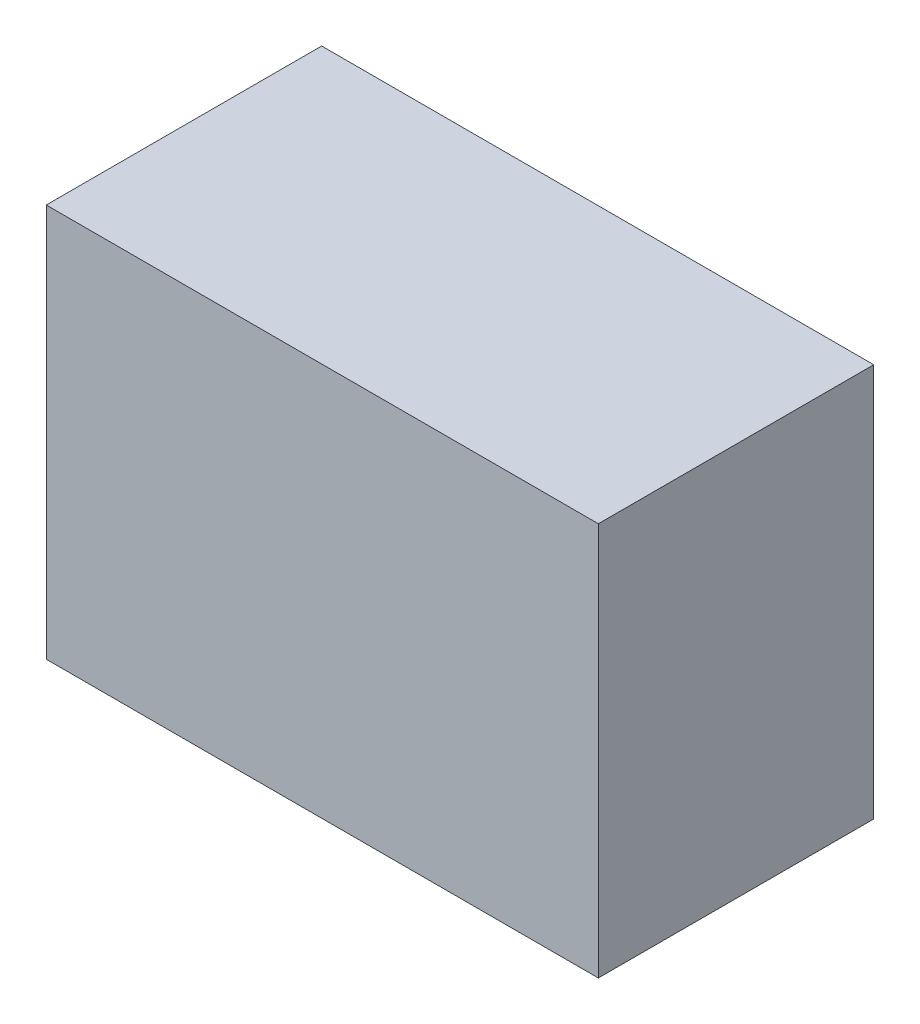
ISO-10303-21;
HEADER;
FILE_DESCRIPTION(('STEP AP214'),'2;1');
FILE_NAME('part.step','',(''),(''),'','','');
FILE_SCHEMA(('AUTOMOTIVE_DESIGN { 1 0 10303 214 1 1 1 1 }'));
ENDSEC;
DATA;
#1=APPLICATION_CONTEXT('core data for automotive mechanical design processes');
#2=APPLICATION_PROTOCOL_DEFINITION('international standard','automotive_design',2000,#1);
#3=PRODUCT_CONTEXT('',#1,'mechanical');
#4=PRODUCT('Part','Part','',(#3));
#5=PRODUCT_RELATED_PRODUCT_CATEGORY('part','',(#4));
#6=PRODUCT_DEFINITION_FORMATION('','',#4);
#7=PRODUCT_DEFINITION_CONTEXT('part definition',#1,'design');
#8=PRODUCT_DEFINITION('design','',#6,#7);
#9=PRODUCT_DEFINITION_SHAPE('','',#8);
#10=(LENGTH_UNIT() NAMED_UNIT(*) SI_UNIT(.MILLI.,.METRE.));
#11=(NAMED_UNIT(*) PLANE_ANGLE_UNIT() SI_UNIT($,.RADIAN.));
#12=(NAMED_UNIT(*) SI_UNIT($,.STERADIAN.) SOLID_ANGLE_UNIT());
#13=UNCERTAINTY_MEASURE_WITH_UNIT(LENGTH_MEASURE(1.E-05),#10,'distance_accuracy_value','');
#14=(GEOMETRIC_REPRESENTATION_CONTEXT(3) GLOBAL_UNCERTAINTY_ASSIGNED_CONTEXT((#13)) GLOBAL_UNIT_ASSIGNED_CONTEXT((#10,
#11,#12)) REPRESENTATION_CONTEXT('',''));
#15=CARTESIAN_POINT('',(0.,0.,0.));
#16=DIRECTION('',(0.,0.,1.));
#17=DIRECTION('',(1.,0.,0.));
#18=AXIS2_PLACEMENT_3D('',#15,#16,#17);
#19=CARTESIAN_POINT('',(-8.42,1.75,8.4));
#20=DIRECTION('',(1.,0.,0.));
#21=DIRECTION('',(0.,0.,-1.));
#22=AXIS2_PLACEMENT_3D('',#19,#20,#21);
#23=PLANE('',#22);
#24=DIRECTION('',(0.,-1.,0.));
#25=VECTOR('',#24,1.);
#26=CARTESIAN_POINT('',(-8.42,1.75,0.));
#27=LINE('',#26,#25);
#28=CARTESIAN_POINT('',(-8.42,1.75,0.));
#29=VERTEX_POINT('',#28);
#30=CARTESIAN_POINT('',(-8.42,-10.25,0.));
#31=VERTEX_POINT('',#30);
#32=EDGE_CURVE('E190',#29,#31,#27,.T.);
#33=ORIENTED_EDGE('',*,*,#32,.T.);
#34=DIRECTION('',(0.,0.,-1.));
#35=VECTOR('',#34,1.);
#36=CARTESIAN_POINT('',(-8.42,-10.25,8.4));
#37=LINE('',#36,#35);
#38=CARTESIAN_POINT('',(-8.42,-10.25,8.4));
#39=VERTEX_POINT('',#38);
#40=EDGE_CURVE('E12',#39,#31,#37,.T.);
#41=ORIENTED_EDGE('',*,*,#40,.F.);
#42=DIRECTION('',(0.,-1.,0.));
#43=VECTOR('',#42,1.);
#44=CARTESIAN_POINT('',(-8.42,1.75,8.4));
#45=LINE('',#44,#43);
#46=CARTESIAN_POINT('',(-8.42,1.75,8.4));
#47=VERTEX_POINT('',#46);
#48=EDGE_CURVE('E192',#47,#39,#45,.T.);
#49=ORIENTED_EDGE('',*,*,#48,.F.);
#50=DIRECTION('',(0.,0.,-1.));
#51=VECTOR('',#50,1.);
#52=CARTESIAN_POINT('',(-8.42,1.75,8.4));
#53=LINE('',#52,#51);
#54=EDGE_CURVE('E198',#47,#29,#53,.T.);
#55=ORIENTED_EDGE('',*,*,#54,.T.);
#56=EDGE_LOOP('',(#33,#41,#49,#55));
#57=FACE_BOUND('',#56,.T.);
#58=ADVANCED_FACE('F39',(#57),#23,.F.);
#59=CARTESIAN_POINT('',(-8.42,-10.25,8.4));
#60=DIRECTION('',(0.,1.,0.));
#61=DIRECTION('',(0.,0.,1.));
#62=AXIS2_PLACEMENT_3D('',#59,#60,#61);
#63=PLANE('',#62);
#64=DIRECTION('',(1.,0.,0.));
#65=VECTOR('',#64,1.);
#66=CARTESIAN_POINT('',(-7.42,-10.25,1.7));
#67=LINE('',#66,#65);
#68=CARTESIAN_POINT('',(-7.42,-10.25,1.7));
#69=VERTEX_POINT('',#68);
#70=CARTESIAN_POINT('',(-6.82,-10.25,1.7));
#71=VERTEX_POINT('',#70);
#72=EDGE_CURVE('E152',#69,#71,#67,.T.);
#73=ORIENTED_EDGE('',*,*,#72,.F.);
#74=DIRECTION('',(0.,0.,-1.));
#75=VECTOR('',#74,1.);
#76=CARTESIAN_POINT('',(-7.42,-10.25,6.9));
#77=LINE('',#76,#75);
#78=CARTESIAN_POINT('',(-7.42,-10.25,6.9));
#79=VERTEX_POINT('',#78);
#80=EDGE_CURVE('E53',#79,#69,#77,.T.);
#81=ORIENTED_EDGE('',*,*,#80,.F.);
#82=DIRECTION('',(-1.,0.,0.));
#83=VECTOR('',#82,1.);
#84=CARTESIAN_POINT('',(7.42,-10.25,6.9));
#85=LINE('',#84,#83);
#86=CARTESIAN_POINT('',(7.42,-10.25,6.9));
#87=VERTEX_POINT('',#86);
#88=EDGE_CURVE('E173',#87,#79,#85,.T.);
#89=ORIENTED_EDGE('',*,*,#88,.F.);
#90=DIRECTION('',(0.,0.,1.));
#91=VECTOR('',#90,1.);
#92=CARTESIAN_POINT('',(7.42,-10.25,6.9));
#93=LINE('',#92,#91);
#94=CARTESIAN_POINT('',(7.42,-10.25,1.7));
#95=VERTEX_POINT('',#94);
#96=EDGE_CURVE('E170',#95,#87,#93,.T.);
#97=ORIENTED_EDGE('',*,*,#96,.F.);
#98=DIRECTION('',(1.,0.,0.));
#99=VECTOR('',#98,1.);
#100=CARTESIAN_POINT('',(7.42,-10.25,1.7));
#101=LINE('',#100,#99);
#102=CARTESIAN_POINT('',(6.82,-10.25,1.7));
#103=VERTEX_POINT('',#102);
#104=EDGE_CURVE('E167',#103,#95,#101,.T.);
#105=ORIENTED_EDGE('',*,*,#104,.F.);
#106=CARTESIAN_POINT('',(4.54666666666667,-10.25,3.78402222222222));
#107=DIRECTION('',(0.,-1.,0.));
#108=DIRECTION('',(0.,0.,1.));
#109=AXIS2_PLACEMENT_3D('',#106,#107,#108);
#110=CIRCLE('',#109,3.08402222222222);
#111=CARTESIAN_POINT('',(2.27333333333333,-10.25,1.7));
#112=VERTEX_POINT('',#111);
#113=EDGE_CURVE('E161',#112,#103,#110,.T.);
#114=ORIENTED_EDGE('',*,*,#113,.F.);
#115=CARTESIAN_POINT('',(0.,-10.25,3.78402222222222));
#116=DIRECTION('',(0.,-1.,0.));
#117=DIRECTION('',(0.,0.,-1.));
#118=AXIS2_PLACEMENT_3D('',#115,#116,#117);
#119=CIRCLE('',#118,3.08402222222222);
#120=CARTESIAN_POINT('',(-2.27333333333333,-10.25,1.7));
#121=VERTEX_POINT('',#120);
#122=EDGE_CURVE('E159',#121,#112,#119,.T.);
#123=ORIENTED_EDGE('',*,*,#122,.F.);
#124=CARTESIAN_POINT('',(-4.54666666666667,-10.25,3.78402222222222));
#125=DIRECTION('',(0.,-1.,0.));
#126=DIRECTION('',(0.,0.,-1.));
#127=AXIS2_PLACEMENT_3D('',#124,#125,#126);
#128=CIRCLE('',#127,3.08402222222222);
#129=EDGE_CURVE('E142',#71,#121,#128,.T.);
#130=ORIENTED_EDGE('',*,*,#129,.F.);
#131=EDGE_LOOP('',(#73,#81,#89,#97,#105,#114,#123,#130));
#132=FACE_BOUND('',#131,.T.);
#133=DIRECTION('',(1.,0.,0.));
#134=VECTOR('',#133,1.);
#135=CARTESIAN_POINT('',(-8.42,-10.25,0.));
#136=LINE('',#135,#134);
#137=CARTESIAN_POINT('',(8.42,-10.25,0.));
#138=VERTEX_POINT('',#137);
#139=EDGE_CURVE('E201',#31,#138,#136,.T.);
#140=ORIENTED_EDGE('',*,*,#139,.T.);
#141=DIRECTION('',(0.,0.,-1.));
#142=VECTOR('',#141,1.);
#143=CARTESIAN_POINT('',(8.42,-10.25,8.4));
#144=LINE('',#143,#142);
#145=CARTESIAN_POINT('',(8.42,-10.25,8.4));
#146=VERTEX_POINT('',#145);
#147=EDGE_CURVE('E46',#146,#138,#144,.T.);
#148=ORIENTED_EDGE('',*,*,#147,.F.);
#149=DIRECTION('',(1.,0.,0.));
#150=VECTOR('',#149,1.);
#151=CARTESIAN_POINT('',(-8.42,-10.25,8.4));
#152=LINE('',#151,#150);
#153=EDGE_CURVE('E90',#39,#146,#152,.T.);
#154=ORIENTED_EDGE('',*,*,#153,.F.);
#155=ORIENTED_EDGE('',*,*,#40,.T.);
#156=EDGE_LOOP('',(#140,#148,#154,#155));
#157=FACE_BOUND('',#156,.T.);
#158=ADVANCED_FACE('F156',(#132,#157),#63,.F.);
#159=CARTESIAN_POINT('',(8.42,1.75,8.4));
#160=DIRECTION('',(-1.,0.,0.));
#161=DIRECTION('',(0.,-1.,0.));
#162=AXIS2_PLACEMENT_3D('',#159,#160,#161);
#163=PLANE('',#162);
#164=DIRECTION('',(0.,1.,0.));
#165=VECTOR('',#164,1.);
#166=CARTESIAN_POINT('',(8.42,1.75,0.));
#167=LINE('',#166,#165);
#168=CARTESIAN_POINT('',(8.42,1.75,0.));
#169=VERTEX_POINT('',#168);
#170=EDGE_CURVE('E203',#138,#169,#167,.T.);
#171=ORIENTED_EDGE('',*,*,#170,.T.);
#172=DIRECTION('',(0.,0.,-1.));
#173=VECTOR('',#172,1.);
#174=CARTESIAN_POINT('',(8.42,1.75,8.4));
#175=LINE('',#174,#173);
#176=CARTESIAN_POINT('',(8.42,1.75,8.4));
#177=VERTEX_POINT('',#176);
#178=EDGE_CURVE('E207',#177,#169,#175,.T.);
#179=ORIENTED_EDGE('',*,*,#178,.F.);
#180=DIRECTION('',(0.,1.,0.));
#181=VECTOR('',#180,1.);
#182=CARTESIAN_POINT('',(8.42,1.75,8.4));
#183=LINE('',#182,#181);
#184=EDGE_CURVE('E195',#146,#177,#183,.T.);
#185=ORIENTED_EDGE('',*,*,#184,.F.);
#186=ORIENTED_EDGE('',*,*,#147,.T.);
#187=EDGE_LOOP('',(#171,#179,#185,#186));
#188=FACE_BOUND('',#187,.T.);
#189=ADVANCED_FACE('F212',(#188),#163,.F.);
#190=CARTESIAN_POINT('',(-8.42,1.75,8.4));
#191=DIRECTION('',(0.,-1.,0.));
#192=DIRECTION('',(0.,0.,-1.));
#193=AXIS2_PLACEMENT_3D('',#190,#191,#192);
#194=PLANE('',#193);
#195=DIRECTION('',(-1.,0.,0.));
#196=VECTOR('',#195,1.);
#197=CARTESIAN_POINT('',(-8.42,1.75,0.));
#198=LINE('',#197,#196);
#199=EDGE_CURVE('E83',#169,#29,#198,.T.);
#200=ORIENTED_EDGE('',*,*,#199,.T.);
#201=ORIENTED_EDGE('',*,*,#54,.F.);
#202=DIRECTION('',(-1.,0.,0.));
#203=VECTOR('',#202,1.);
#204=CARTESIAN_POINT('',(-8.42,1.75,8.4));
#205=LINE('',#204,#203);
#206=EDGE_CURVE('E62',#177,#47,#205,.T.);
#207=ORIENTED_EDGE('',*,*,#206,.F.);
#208=ORIENTED_EDGE('',*,*,#178,.T.);
#209=EDGE_LOOP('',(#200,#201,#207,#208));
#210=FACE_BOUND('',#209,.T.);
#211=ADVANCED_FACE('F220',(#210),#194,.F.);
#212=CARTESIAN_POINT('',(0.,0.,8.4));
#213=DIRECTION('',(0.,0.,1.));
#214=DIRECTION('',(1.,0.,0.));
#215=AXIS2_PLACEMENT_3D('',#212,#213,#214);
#216=PLANE('',#215);
#217=ORIENTED_EDGE('',*,*,#48,.T.);
#218=ORIENTED_EDGE('',*,*,#153,.T.);
#219=ORIENTED_EDGE('',*,*,#184,.T.);
#220=ORIENTED_EDGE('',*,*,#206,.T.);
#221=EDGE_LOOP('',(#217,#218,#219,#220));
#222=FACE_BOUND('',#221,.T.);
#223=ADVANCED_FACE('F222',(#222),#216,.T.);
#224=CARTESIAN_POINT('',(0.,0.,0.));
#225=DIRECTION('',(0.,0.,1.));
#226=DIRECTION('',(1.,0.,0.));
#227=AXIS2_PLACEMENT_3D('',#224,#225,#226);
#228=PLANE('',#227);
#229=ORIENTED_EDGE('',*,*,#32,.F.);
#230=ORIENTED_EDGE('',*,*,#199,.F.);
#231=ORIENTED_EDGE('',*,*,#170,.F.);
#232=ORIENTED_EDGE('',*,*,#139,.F.);
#233=EDGE_LOOP('',(#229,#230,#231,#232));
#234=FACE_BOUND('',#233,.T.);
#235=ADVANCED_FACE('F216',(#234),#228,.F.);
#236=CARTESIAN_POINT('',(-7.42,17.8330842813187,6.9));
#237=DIRECTION('',(-1.,0.,0.));
#238=DIRECTION('',(0.,0.,1.));
#239=AXIS2_PLACEMENT_3D('',#236,#237,#238);
#240=PLANE('',#239);
#241=DIRECTION('',(0.,0.,1.));
#242=VECTOR('',#241,1.);
#243=CARTESIAN_POINT('',(-7.42,-2.25,6.9));
#244=LINE('',#243,#242);
#245=CARTESIAN_POINT('',(-7.42,-2.25,1.7));
#246=VERTEX_POINT('',#245);
#247=CARTESIAN_POINT('',(-7.42,-2.25,6.9));
#248=VERTEX_POINT('',#247);
#249=EDGE_CURVE('E191',#246,#248,#244,.T.);
#250=ORIENTED_EDGE('',*,*,#249,.T.);
#251=DIRECTION('',(0.,-1.,0.));
#252=VECTOR('',#251,1.);
#253=CARTESIAN_POINT('',(-7.42,17.8330842813187,6.9));
#254=LINE('',#253,#252);
#255=EDGE_CURVE('E176',#248,#79,#254,.T.);
#256=ORIENTED_EDGE('',*,*,#255,.T.);
#257=ORIENTED_EDGE('',*,*,#80,.T.);
#258=DIRECTION('',(0.,-1.,0.));
#259=VECTOR('',#258,1.);
#260=CARTESIAN_POINT('',(-7.42,17.8330842813187,1.7));
#261=LINE('',#260,#259);
#262=EDGE_CURVE('E149',#246,#69,#261,.T.);
#263=ORIENTED_EDGE('',*,*,#262,.F.);
#264=EDGE_LOOP('',(#250,#256,#257,#263));
#265=FACE_BOUND('',#264,.T.);
#266=ADVANCED_FACE('F262',(#265),#240,.F.);
#267=CARTESIAN_POINT('',(7.42,17.8330842813187,6.9));
#268=DIRECTION('',(0.,0.,1.));
#269=DIRECTION('',(1.,0.,0.));
#270=AXIS2_PLACEMENT_3D('',#267,#268,#269);
#271=PLANE('',#270);
#272=DIRECTION('',(1.,0.,0.));
#273=VECTOR('',#272,1.);
#274=CARTESIAN_POINT('',(7.42,-2.25,6.9));
#275=LINE('',#274,#273);
#276=CARTESIAN_POINT('',(7.42,-2.25,6.9));
#277=VERTEX_POINT('',#276);
#278=EDGE_CURVE('E352',#248,#277,#275,.T.);
#279=ORIENTED_EDGE('',*,*,#278,.T.);
#280=DIRECTION('',(0.,-1.,0.));
#281=VECTOR('',#280,1.);
#282=CARTESIAN_POINT('',(7.42,17.8330842813187,6.9));
#283=LINE('',#282,#281);
#284=EDGE_CURVE('E178',#277,#87,#283,.T.);
#285=ORIENTED_EDGE('',*,*,#284,.T.);
#286=ORIENTED_EDGE('',*,*,#88,.T.);
#287=ORIENTED_EDGE('',*,*,#255,.F.);
#288=EDGE_LOOP('',(#279,#285,#286,#287));
#289=FACE_BOUND('',#288,.T.);
#290=ADVANCED_FACE('F270',(#289),#271,.F.);
#291=CARTESIAN_POINT('',(7.42,17.8330842813187,6.9));
#292=DIRECTION('',(1.,0.,0.));
#293=DIRECTION('',(0.,0.,-1.));
#294=AXIS2_PLACEMENT_3D('',#291,#292,#293);
#295=PLANE('',#294);
#296=DIRECTION('',(0.,0.,-1.));
#297=VECTOR('',#296,1.);
#298=CARTESIAN_POINT('',(7.42,-2.25,6.9));
#299=LINE('',#298,#297);
#300=CARTESIAN_POINT('',(7.42,-2.25,1.7));
#301=VERTEX_POINT('',#300);
#302=EDGE_CURVE('E355',#277,#301,#299,.T.);
#303=ORIENTED_EDGE('',*,*,#302,.T.);
#304=DIRECTION('',(0.,-1.,0.));
#305=VECTOR('',#304,1.);
#306=CARTESIAN_POINT('',(7.42,17.8330842813187,1.7));
#307=LINE('',#306,#305);
#308=EDGE_CURVE('E180',#301,#95,#307,.T.);
#309=ORIENTED_EDGE('',*,*,#308,.T.);
#310=ORIENTED_EDGE('',*,*,#96,.T.);
#311=ORIENTED_EDGE('',*,*,#284,.F.);
#312=EDGE_LOOP('',(#303,#309,#310,#311));
#313=FACE_BOUND('',#312,.T.);
#314=ADVANCED_FACE('F276',(#313),#295,.F.);
#315=CARTESIAN_POINT('',(7.42,17.8330842813187,1.7));
#316=DIRECTION('',(0.,0.,-1.));
#317=DIRECTION('',(-1.,0.,0.));
#318=AXIS2_PLACEMENT_3D('',#315,#316,#317);
#319=PLANE('',#318);
#320=DIRECTION('',(-1.,0.,0.));
#321=VECTOR('',#320,1.);
#322=CARTESIAN_POINT('',(7.42,-2.25,1.7));
#323=LINE('',#322,#321);
#324=CARTESIAN_POINT('',(6.82,-2.25,1.7));
#325=VERTEX_POINT('',#324);
#326=EDGE_CURVE('E359',#301,#325,#323,.T.);
#327=ORIENTED_EDGE('',*,*,#326,.T.);
#328=DIRECTION('',(0.,-1.,0.));
#329=VECTOR('',#328,1.);
#330=CARTESIAN_POINT('',(6.82,17.8330842813187,1.7));
#331=LINE('',#330,#329);
#332=EDGE_CURVE('E182',#325,#103,#331,.T.);
#333=ORIENTED_EDGE('',*,*,#332,.T.);
#334=ORIENTED_EDGE('',*,*,#104,.T.);
#335=ORIENTED_EDGE('',*,*,#308,.F.);
#336=EDGE_LOOP('',(#327,#333,#334,#335));
#337=FACE_BOUND('',#336,.T.);
#338=ADVANCED_FACE('F284',(#337),#319,.F.);
#339=CARTESIAN_POINT('',(4.54666666666667,17.8330842813187,3.78402222222222));
#340=DIRECTION('',(0.,-1.,0.));
#341=DIRECTION('',(0.,0.,-1.));
#342=AXIS2_PLACEMENT_3D('',#339,#340,#341);
#343=CYLINDRICAL_SURFACE('',#342,3.08402222222222);
#344=CARTESIAN_POINT('',(4.54666666666667,-2.25,3.78402222222222));
#345=DIRECTION('',(0.,-1.,0.));
#346=DIRECTION('',(0.,0.,-1.));
#347=AXIS2_PLACEMENT_3D('',#344,#345,#346);
#348=CIRCLE('',#347,3.08402222222222);
#349=CARTESIAN_POINT('',(2.27333333333333,-2.25,1.7));
#350=VERTEX_POINT('',#349);
#351=EDGE_CURVE('E361',#325,#350,#348,.F.);
#352=ORIENTED_EDGE('',*,*,#351,.T.);
#353=DIRECTION('',(0.,-1.,0.));
#354=VECTOR('',#353,1.);
#355=CARTESIAN_POINT('',(2.27333333333333,17.8330842813187,1.7));
#356=LINE('',#355,#354);
#357=EDGE_CURVE('E184',#350,#112,#356,.T.);
#358=ORIENTED_EDGE('',*,*,#357,.T.);
#359=ORIENTED_EDGE('',*,*,#113,.T.);
#360=ORIENTED_EDGE('',*,*,#332,.F.);
#361=EDGE_LOOP('',(#352,#358,#359,#360));
#362=FACE_BOUND('',#361,.T.);
#363=ADVANCED_FACE('F292',(#362),#343,.F.);
#364=CARTESIAN_POINT('',(0.,17.8330842813187,3.78402222222222));
#365=DIRECTION('',(0.,-1.,0.));
#366=DIRECTION('',(0.,0.,-1.));
#367=AXIS2_PLACEMENT_3D('',#364,#365,#366);
#368=CYLINDRICAL_SURFACE('',#367,3.08402222222222);
#369=CARTESIAN_POINT('',(0.,-2.25,3.78402222222222));
#370=DIRECTION('',(0.,-1.,0.));
#371=DIRECTION('',(0.,0.,-1.));
#372=AXIS2_PLACEMENT_3D('',#369,#370,#371);
#373=CIRCLE('',#372,3.08402222222222);
#374=CARTESIAN_POINT('',(-2.27333333333333,-2.25,1.7));
#375=VERTEX_POINT('',#374);
#376=EDGE_CURVE('E363',#350,#375,#373,.F.);
#377=ORIENTED_EDGE('',*,*,#376,.T.);
#378=DIRECTION('',(0.,-1.,0.));
#379=VECTOR('',#378,1.);
#380=CARTESIAN_POINT('',(-2.27333333333333,17.8330842813187,1.7));
#381=LINE('',#380,#379);
#382=EDGE_CURVE('E148',#375,#121,#381,.T.);
#383=ORIENTED_EDGE('',*,*,#382,.T.);
#384=ORIENTED_EDGE('',*,*,#122,.T.);
#385=ORIENTED_EDGE('',*,*,#357,.F.);
#386=EDGE_LOOP('',(#377,#383,#384,#385));
#387=FACE_BOUND('',#386,.T.);
#388=ADVANCED_FACE('F300',(#387),#368,.F.);
#389=CARTESIAN_POINT('',(-4.54666666666667,17.8330842813187,3.78402222222222));
#390=DIRECTION('',(0.,-1.,0.));
#391=DIRECTION('',(0.,0.,-1.));
#392=AXIS2_PLACEMENT_3D('',#389,#390,#391);
#393=CYLINDRICAL_SURFACE('',#392,3.08402222222222);
#394=CARTESIAN_POINT('',(-4.54666666666667,-2.25,3.78402222222222));
#395=DIRECTION('',(0.,-1.,0.));
#396=DIRECTION('',(0.,0.,-1.));
#397=AXIS2_PLACEMENT_3D('',#394,#395,#396);
#398=CIRCLE('',#397,3.08402222222222);
#399=CARTESIAN_POINT('',(-6.82,-2.25,1.7));
#400=VERTEX_POINT('',#399);
#401=EDGE_CURVE('E145',#375,#400,#398,.F.);
#402=ORIENTED_EDGE('',*,*,#401,.T.);
#403=DIRECTION('',(0.,-1.,0.));
#404=VECTOR('',#403,1.);
#405=CARTESIAN_POINT('',(-6.82,17.8330842813187,1.7));
#406=LINE('',#405,#404);
#407=EDGE_CURVE('E137',#400,#71,#406,.T.);
#408=ORIENTED_EDGE('',*,*,#407,.T.);
#409=ORIENTED_EDGE('',*,*,#129,.T.);
#410=ORIENTED_EDGE('',*,*,#382,.F.);
#411=EDGE_LOOP('',(#402,#408,#409,#410));
#412=FACE_BOUND('',#411,.T.);
#413=ADVANCED_FACE('F139',(#412),#393,.F.);
#414=CARTESIAN_POINT('',(-7.42,17.8330842813187,1.7));
#415=DIRECTION('',(0.,0.,-1.));
#416=DIRECTION('',(-1.,0.,0.));
#417=AXIS2_PLACEMENT_3D('',#414,#415,#416);
#418=PLANE('',#417);
#419=DIRECTION('',(-1.,0.,0.));
#420=VECTOR('',#419,1.);
#421=CARTESIAN_POINT('',(-7.42,-2.25,1.7));
#422=LINE('',#421,#420);
#423=EDGE_CURVE('E188',#400,#246,#422,.T.);
#424=ORIENTED_EDGE('',*,*,#423,.T.);
#425=ORIENTED_EDGE('',*,*,#262,.T.);
#426=ORIENTED_EDGE('',*,*,#72,.T.);
#427=ORIENTED_EDGE('',*,*,#407,.F.);
#428=EDGE_LOOP('',(#424,#425,#426,#427));
#429=FACE_BOUND('',#428,.T.);
#430=ADVANCED_FACE('F153',(#429),#418,.F.);
#431=CARTESIAN_POINT('',(-8.42,-2.25,8.4));
#432=DIRECTION('',(0.,-1.,0.));
#433=DIRECTION('',(0.,0.,-1.));
#434=AXIS2_PLACEMENT_3D('',#431,#432,#433);
#435=PLANE('',#434);
#436=ORIENTED_EDGE('',*,*,#249,.F.);
#437=ORIENTED_EDGE('',*,*,#423,.F.);
#438=ORIENTED_EDGE('',*,*,#401,.F.);
#439=ORIENTED_EDGE('',*,*,#376,.F.);
#440=ORIENTED_EDGE('',*,*,#351,.F.);
#441=ORIENTED_EDGE('',*,*,#326,.F.);
#442=ORIENTED_EDGE('',*,*,#302,.F.);
#443=ORIENTED_EDGE('',*,*,#278,.F.);
#444=EDGE_LOOP('',(#436,#437,#438,#439,#440,#441,#442,#443));
#445=FACE_BOUND('',#444,.T.);
#446=ADVANCED_FACE('F321',(#445),#435,.T.);
#447=CLOSED_SHELL('',(#58,#158,#189,#211,#223,#235,#266,#290,#314,#338,#363,#388,#413,#430,#446));
#448=MANIFOLD_SOLID_BREP('B2',#447);
#449=ADVANCED_BREP_SHAPE_REPRESENTATION('',(#18,#448),#14);
#450=SHAPE_DEFINITION_REPRESENTATION(#9,#449);
ENDSEC;
END-ISO-10303-21;
